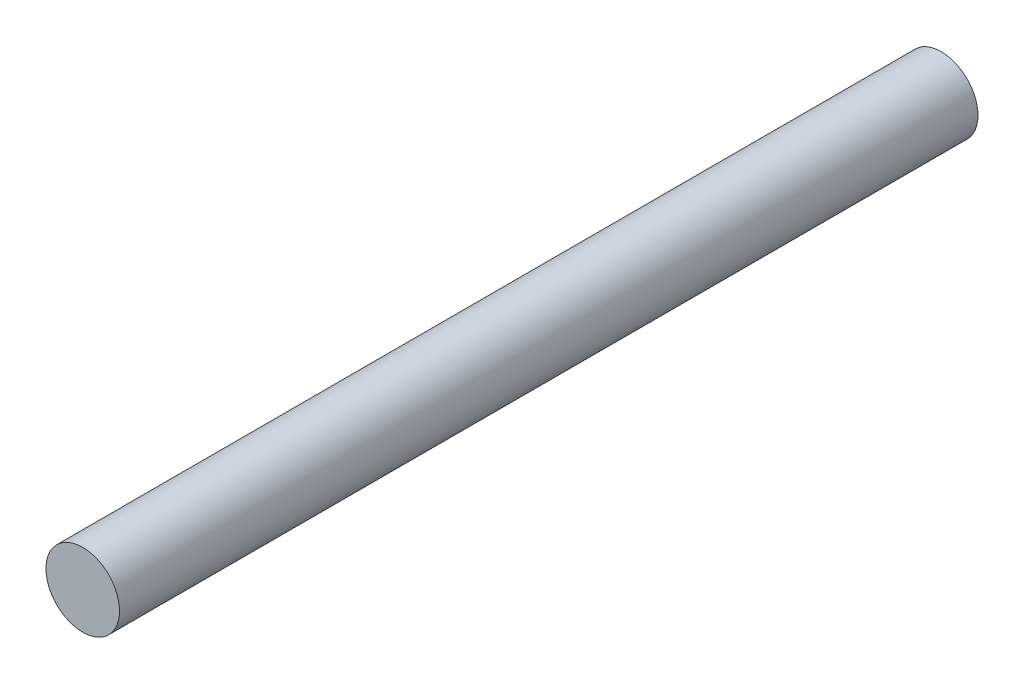
ISO-10303-21;
HEADER;
FILE_DESCRIPTION(('STEP AP214'),'2;1');
FILE_NAME('part.step','',(''),(''),'','','');
FILE_SCHEMA(('AUTOMOTIVE_DESIGN { 1 0 10303 214 1 1 1 1 }'));
ENDSEC;
DATA;
#1=APPLICATION_CONTEXT('core data for automotive mechanical design processes');
#2=APPLICATION_PROTOCOL_DEFINITION('international standard','automotive_design',2000,#1);
#3=PRODUCT_CONTEXT('',#1,'mechanical');
#4=PRODUCT('Part','Part','',(#3));
#5=PRODUCT_RELATED_PRODUCT_CATEGORY('part','',(#4));
#6=PRODUCT_DEFINITION_FORMATION('','',#4);
#7=PRODUCT_DEFINITION_CONTEXT('part definition',#1,'design');
#8=PRODUCT_DEFINITION('design','',#6,#7);
#9=PRODUCT_DEFINITION_SHAPE('','',#8);
#10=(LENGTH_UNIT() NAMED_UNIT(*) SI_UNIT(.MILLI.,.METRE.));
#11=(NAMED_UNIT(*) PLANE_ANGLE_UNIT() SI_UNIT($,.RADIAN.));
#12=(NAMED_UNIT(*) SI_UNIT($,.STERADIAN.) SOLID_ANGLE_UNIT());
#13=UNCERTAINTY_MEASURE_WITH_UNIT(LENGTH_MEASURE(1.E-05),#10,'distance_accuracy_value','');
#14=(GEOMETRIC_REPRESENTATION_CONTEXT(3) GLOBAL_UNCERTAINTY_ASSIGNED_CONTEXT((#13)) GLOBAL_UNIT_ASSIGNED_CONTEXT((#10,
#11,#12)) REPRESENTATION_CONTEXT('',''));
#15=CARTESIAN_POINT('',(0.,0.,0.));
#16=DIRECTION('',(0.,0.,1.));
#17=DIRECTION('',(1.,0.,0.));
#18=AXIS2_PLACEMENT_3D('',#15,#16,#17);
#19=CARTESIAN_POINT('',(0.,0.,70.));
#20=DIRECTION('',(0.,0.,-1.));
#21=DIRECTION('',(-1.,0.,0.));
#22=AXIS2_PLACEMENT_3D('',#19,#20,#21);
#23=CYLINDRICAL_SURFACE('',#22,3.);
#24=CARTESIAN_POINT('',(0.,0.,70.));
#25=DIRECTION('',(0.,0.,1.));
#26=DIRECTION('',(1.,0.,0.));
#27=AXIS2_PLACEMENT_3D('',#24,#25,#26);
#28=CIRCLE('',#27,3.);
#29=CARTESIAN_POINT('',(3.,0.,70.));
#30=VERTEX_POINT('',#29);
#31=EDGE_CURVE('E10',#30,#30,#28,.T.);
#32=ORIENTED_EDGE('',*,*,#31,.F.);
#33=EDGE_LOOP('',(#32));
#34=FACE_BOUND('',#33,.T.);
#35=CARTESIAN_POINT('',(0.,0.,0.));
#36=DIRECTION('',(0.,0.,1.));
#37=DIRECTION('',(1.,0.,0.));
#38=AXIS2_PLACEMENT_3D('',#35,#36,#37);
#39=CIRCLE('',#38,3.);
#40=CARTESIAN_POINT('',(3.,0.,0.));
#41=VERTEX_POINT('',#40);
#42=EDGE_CURVE('E37',#41,#41,#39,.T.);
#43=ORIENTED_EDGE('',*,*,#42,.T.);
#44=EDGE_LOOP('',(#43));
#45=FACE_BOUND('',#44,.T.);
#46=ADVANCED_FACE('F34',(#34,#45),#23,.T.);
#47=CARTESIAN_POINT('',(0.,0.,70.));
#48=DIRECTION('',(0.,0.,1.));
#49=DIRECTION('',(1.,0.,0.));
#50=AXIS2_PLACEMENT_3D('',#47,#48,#49);
#51=PLANE('',#50);
#52=ORIENTED_EDGE('',*,*,#31,.T.);
#53=EDGE_LOOP('',(#52));
#54=FACE_BOUND('',#53,.T.);
#55=ADVANCED_FACE('F51',(#54),#51,.T.);
#56=CARTESIAN_POINT('',(0.,0.,0.));
#57=DIRECTION('',(0.,0.,1.));
#58=DIRECTION('',(1.,0.,0.));
#59=AXIS2_PLACEMENT_3D('',#56,#57,#58);
#60=PLANE('',#59);
#61=ORIENTED_EDGE('',*,*,#42,.F.);
#62=EDGE_LOOP('',(#61));
#63=FACE_BOUND('',#62,.T.);
#64=ADVANCED_FACE('F49',(#63),#60,.F.);
#65=CLOSED_SHELL('',(#46,#55,#64));
#66=MANIFOLD_SOLID_BREP('B2',#65);
#67=ADVANCED_BREP_SHAPE_REPRESENTATION('',(#18,#66),#14);
#68=SHAPE_DEFINITION_REPRESENTATION(#9,#67);
ENDSEC;
END-ISO-10303-21;
